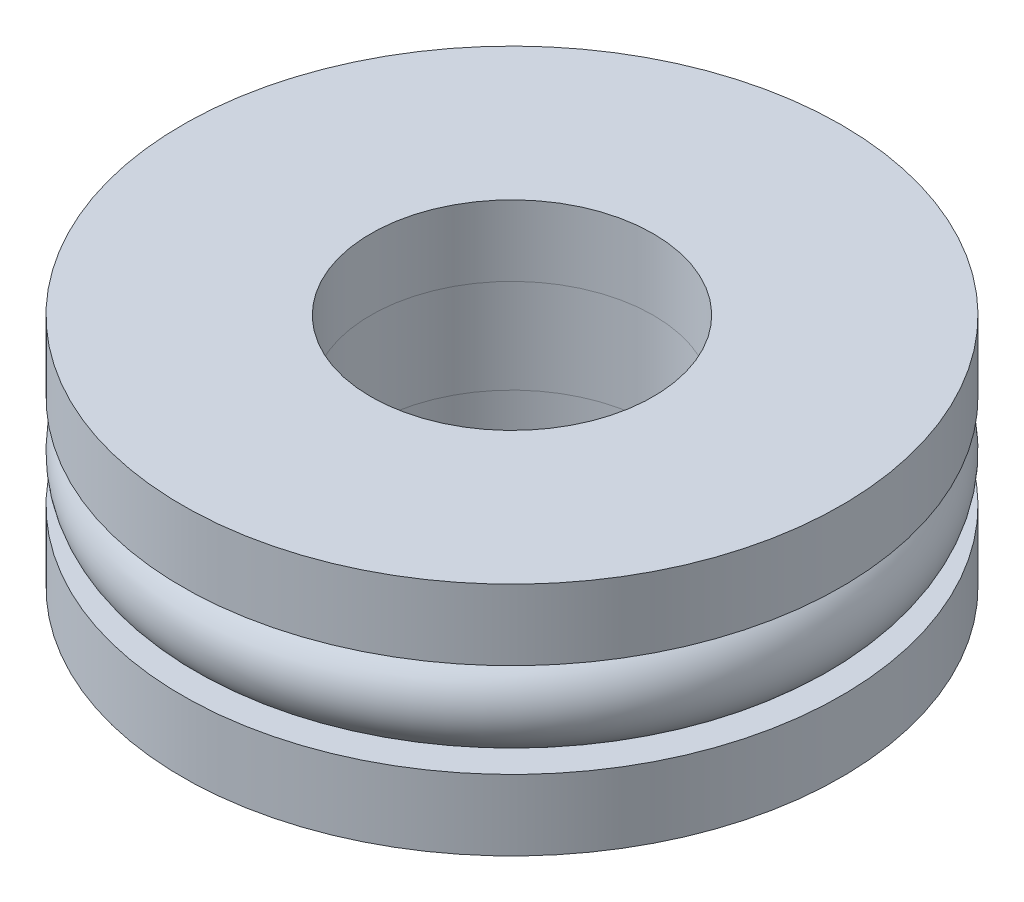
ISO-10303-21;
HEADER;
FILE_DESCRIPTION(('STEP AP214'),'2;1');
FILE_NAME('part.step','',(''),(''),'','','');
FILE_SCHEMA(('AUTOMOTIVE_DESIGN { 1 0 10303 214 1 1 1 1 }'));
ENDSEC;
DATA;
#1=APPLICATION_CONTEXT('core data for automotive mechanical design processes');
#2=APPLICATION_PROTOCOL_DEFINITION('international standard','automotive_design',2000,#1);
#3=PRODUCT_CONTEXT('',#1,'mechanical');
#4=PRODUCT('Part','Part','',(#3));
#5=PRODUCT_RELATED_PRODUCT_CATEGORY('part','',(#4));
#6=PRODUCT_DEFINITION_FORMATION('','',#4);
#7=PRODUCT_DEFINITION_CONTEXT('part definition',#1,'design');
#8=PRODUCT_DEFINITION('design','',#6,#7);
#9=PRODUCT_DEFINITION_SHAPE('','',#8);
#10=(LENGTH_UNIT() NAMED_UNIT(*) SI_UNIT(.MILLI.,.METRE.));
#11=(NAMED_UNIT(*) PLANE_ANGLE_UNIT() SI_UNIT($,.RADIAN.));
#12=(NAMED_UNIT(*) SI_UNIT($,.STERADIAN.) SOLID_ANGLE_UNIT());
#13=UNCERTAINTY_MEASURE_WITH_UNIT(LENGTH_MEASURE(1.E-05),#10,'distance_accuracy_value','');
#14=(GEOMETRIC_REPRESENTATION_CONTEXT(3) GLOBAL_UNCERTAINTY_ASSIGNED_CONTEXT((#13)) GLOBAL_UNIT_ASSIGNED_CONTEXT((#10,
#11,#12)) REPRESENTATION_CONTEXT('',''));
#15=CARTESIAN_POINT('',(0.,0.,0.));
#16=DIRECTION('',(0.,0.,1.));
#17=DIRECTION('',(1.,0.,0.));
#18=AXIS2_PLACEMENT_3D('',#15,#16,#17);
#19=CARTESIAN_POINT('',(0.,3.5,-7.));
#20=DIRECTION('',(0.,-1.,0.));
#21=DIRECTION('',(0.,0.,-1.));
#22=AXIS2_PLACEMENT_3D('',#19,#20,#21);
#23=PLANE('',#22);
#24=CARTESIAN_POINT('',(0.,3.5,0.));
#25=DIRECTION('',(0.,-1.,0.));
#26=DIRECTION('',(0.,0.,-1.));
#27=AXIS2_PLACEMENT_3D('',#24,#25,#26);
#28=CIRCLE('',#27,3.);
#29=CARTESIAN_POINT('',(0.,3.5,-3.));
#30=VERTEX_POINT('',#29);
#31=EDGE_CURVE('E53',#30,#30,#28,.F.);
#32=ORIENTED_EDGE('',*,*,#31,.F.);
#33=EDGE_LOOP('',(#32));
#34=FACE_BOUND('',#33,.T.);
#35=CARTESIAN_POINT('',(0.,3.5,0.));
#36=DIRECTION('',(0.,-1.,0.));
#37=DIRECTION('',(0.,0.,-1.));
#38=AXIS2_PLACEMENT_3D('',#35,#36,#37);
#39=CIRCLE('',#38,6.);
#40=CARTESIAN_POINT('',(0.,3.5,-6.));
#41=VERTEX_POINT('',#40);
#42=EDGE_CURVE('E63',#41,#41,#39,.T.);
#43=ORIENTED_EDGE('',*,*,#42,.F.);
#44=EDGE_LOOP('',(#43));
#45=FACE_BOUND('',#44,.T.);
#46=ADVANCED_FACE('F49',(#34,#45),#23,.F.);
#47=CARTESIAN_POINT('',(0.,1.5,-7.));
#48=DIRECTION('',(0.,1.,0.));
#49=DIRECTION('',(0.,0.,1.));
#50=AXIS2_PLACEMENT_3D('',#47,#48,#49);
#51=PLANE('',#50);
#52=CARTESIAN_POINT('',(0.,1.5,0.));
#53=DIRECTION('',(0.,-1.,0.));
#54=DIRECTION('',(0.,0.,-1.));
#55=AXIS2_PLACEMENT_3D('',#52,#53,#54);
#56=CIRCLE('',#55,6.);
#57=CARTESIAN_POINT('',(0.,1.5,-6.));
#58=VERTEX_POINT('',#57);
#59=EDGE_CURVE('E11',#58,#58,#56,.T.);
#60=ORIENTED_EDGE('',*,*,#59,.T.);
#61=EDGE_LOOP('',(#60));
#62=FACE_BOUND('',#61,.T.);
#63=CARTESIAN_POINT('',(0.,1.5,0.));
#64=DIRECTION('',(0.,1.,0.));
#65=DIRECTION('',(0.,0.,1.));
#66=AXIS2_PLACEMENT_3D('',#63,#64,#65);
#67=CIRCLE('',#66,3.);
#68=CARTESIAN_POINT('',(0.,1.5,3.));
#69=VERTEX_POINT('',#68);
#70=EDGE_CURVE('E61',#69,#69,#67,.F.);
#71=ORIENTED_EDGE('',*,*,#70,.F.);
#72=EDGE_LOOP('',(#71));
#73=FACE_BOUND('',#72,.T.);
#74=ADVANCED_FACE('F51',(#62,#73),#51,.F.);
#75=CARTESIAN_POINT('',(0.,0.,0.));
#76=DIRECTION('',(0.,-1.,0.));
#77=DIRECTION('',(0.,0.,-1.));
#78=AXIS2_PLACEMENT_3D('',#75,#76,#77);
#79=CYLINDRICAL_SURFACE('',#78,3.);
#80=ORIENTED_EDGE('',*,*,#31,.T.);
#81=EDGE_LOOP('',(#80));
#82=FACE_BOUND('',#81,.T.);
#83=ORIENTED_EDGE('',*,*,#70,.T.);
#84=EDGE_LOOP('',(#83));
#85=FACE_BOUND('',#84,.T.);
#86=ADVANCED_FACE('F68',(#82,#85),#79,.F.);
#87=CARTESIAN_POINT('',(0.,2.5,0.));
#88=DIRECTION('',(0.,-1.,0.));
#89=DIRECTION('',(0.,0.,-1.));
#90=AXIS2_PLACEMENT_3D('',#87,#88,#89);
#91=TOROIDAL_SURFACE('',#90,6.,1.);
#92=ORIENTED_EDGE('',*,*,#59,.F.);
#93=EDGE_LOOP('',(#92));
#94=FACE_BOUND('',#93,.T.);
#95=ORIENTED_EDGE('',*,*,#42,.T.);
#96=EDGE_LOOP('',(#95));
#97=FACE_BOUND('',#96,.T.);
#98=ADVANCED_FACE('F75',(#94,#97),#91,.T.);
#99=CLOSED_SHELL('',(#46,#74,#86,#98));
#100=MANIFOLD_SOLID_BREP('B2',#99);
#101=CARTESIAN_POINT('',(0.,3.5,-7.));
#102=DIRECTION('',(0.,-1.,0.));
#103=DIRECTION('',(0.,0.,-1.));
#104=AXIS2_PLACEMENT_3D('',#101,#102,#103);
#105=PLANE('',#104);
#106=CARTESIAN_POINT('',(0.,3.5,0.));
#107=DIRECTION('',(0.,-1.,0.));
#108=DIRECTION('',(0.,0.,-1.));
#109=AXIS2_PLACEMENT_3D('',#106,#107,#108);
#110=CIRCLE('',#109,3.);
#111=CARTESIAN_POINT('',(0.,3.5,-3.));
#112=VERTEX_POINT('',#111);
#113=EDGE_CURVE('E139',#112,#112,#110,.F.);
#114=ORIENTED_EDGE('',*,*,#113,.T.);
#115=EDGE_LOOP('',(#114));
#116=FACE_BOUND('',#115,.T.);
#117=CARTESIAN_POINT('',(0.,3.5,0.));
#118=DIRECTION('',(0.,-1.,0.));
#119=DIRECTION('',(0.,0.,-1.));
#120=AXIS2_PLACEMENT_3D('',#117,#118,#119);
#121=CIRCLE('',#120,7.);
#122=CARTESIAN_POINT('',(0.,3.5,-7.));
#123=VERTEX_POINT('',#122);
#124=EDGE_CURVE('E48',#123,#123,#121,.T.);
#125=ORIENTED_EDGE('',*,*,#124,.T.);
#126=EDGE_LOOP('',(#125));
#127=FACE_BOUND('',#126,.T.);
#128=ADVANCED_FACE('F135',(#116,#127),#105,.T.);
#129=CARTESIAN_POINT('',(0.,5.,0.));
#130=DIRECTION('',(0.,-1.,0.));
#131=DIRECTION('',(0.,0.,-1.));
#132=AXIS2_PLACEMENT_3D('',#129,#130,#131);
#133=PLANE('',#132);
#134=CARTESIAN_POINT('',(0.,5.,0.));
#135=DIRECTION('',(0.,-1.,0.));
#136=DIRECTION('',(0.,0.,-1.));
#137=AXIS2_PLACEMENT_3D('',#134,#135,#136);
#138=CIRCLE('',#137,7.);
#139=CARTESIAN_POINT('',(0.,5.,-7.));
#140=VERTEX_POINT('',#139);
#141=EDGE_CURVE('E143',#140,#140,#138,.T.);
#142=ORIENTED_EDGE('',*,*,#141,.F.);
#143=EDGE_LOOP('',(#142));
#144=FACE_BOUND('',#143,.T.);
#145=CARTESIAN_POINT('',(0.,5.,0.));
#146=DIRECTION('',(0.,-1.,0.));
#147=DIRECTION('',(0.,0.,-1.));
#148=AXIS2_PLACEMENT_3D('',#145,#146,#147);
#149=CIRCLE('',#148,3.);
#150=CARTESIAN_POINT('',(0.,5.,-3.));
#151=VERTEX_POINT('',#150);
#152=EDGE_CURVE('E147',#151,#151,#149,.T.);
#153=ORIENTED_EDGE('',*,*,#152,.T.);
#154=EDGE_LOOP('',(#153));
#155=FACE_BOUND('',#154,.T.);
#156=ADVANCED_FACE('F163',(#144,#155),#133,.F.);
#157=CARTESIAN_POINT('',(0.,0.,0.));
#158=DIRECTION('',(0.,-1.,0.));
#159=DIRECTION('',(0.,0.,-1.));
#160=AXIS2_PLACEMENT_3D('',#157,#158,#159);
#161=CYLINDRICAL_SURFACE('',#160,7.);
#162=ORIENTED_EDGE('',*,*,#141,.T.);
#163=EDGE_LOOP('',(#162));
#164=FACE_BOUND('',#163,.T.);
#165=ORIENTED_EDGE('',*,*,#124,.F.);
#166=EDGE_LOOP('',(#165));
#167=FACE_BOUND('',#166,.T.);
#168=ADVANCED_FACE('F137',(#164,#167),#161,.T.);
#169=CARTESIAN_POINT('',(0.,0.,0.));
#170=DIRECTION('',(0.,-1.,0.));
#171=DIRECTION('',(0.,0.,-1.));
#172=AXIS2_PLACEMENT_3D('',#169,#170,#171);
#173=CYLINDRICAL_SURFACE('',#172,3.);
#174=ORIENTED_EDGE('',*,*,#152,.F.);
#175=EDGE_LOOP('',(#174));
#176=FACE_BOUND('',#175,.T.);
#177=ORIENTED_EDGE('',*,*,#113,.F.);
#178=EDGE_LOOP('',(#177));
#179=FACE_BOUND('',#178,.T.);
#180=ADVANCED_FACE('F157',(#176,#179),#173,.F.);
#181=CLOSED_SHELL('',(#128,#156,#168,#180));
#182=MANIFOLD_SOLID_BREP('B6',#181);
#183=CARTESIAN_POINT('',(0.,1.5,-7.));
#184=DIRECTION('',(0.,1.,0.));
#185=DIRECTION('',(0.,0.,1.));
#186=AXIS2_PLACEMENT_3D('',#183,#184,#185);
#187=PLANE('',#186);
#188=CARTESIAN_POINT('',(0.,1.5,0.));
#189=DIRECTION('',(0.,1.,0.));
#190=DIRECTION('',(0.,0.,1.));
#191=AXIS2_PLACEMENT_3D('',#188,#189,#190);
#192=CIRCLE('',#191,3.);
#193=CARTESIAN_POINT('',(0.,1.5,3.));
#194=VERTEX_POINT('',#193);
#195=EDGE_CURVE('E221',#194,#194,#192,.F.);
#196=ORIENTED_EDGE('',*,*,#195,.T.);
#197=EDGE_LOOP('',(#196));
#198=FACE_BOUND('',#197,.T.);
#199=CARTESIAN_POINT('',(0.,1.5,0.));
#200=DIRECTION('',(0.,-1.,0.));
#201=DIRECTION('',(0.,0.,-1.));
#202=AXIS2_PLACEMENT_3D('',#199,#200,#201);
#203=CIRCLE('',#202,7.);
#204=CARTESIAN_POINT('',(0.,1.5,-7.));
#205=VERTEX_POINT('',#204);
#206=EDGE_CURVE('E229',#205,#205,#203,.T.);
#207=ORIENTED_EDGE('',*,*,#206,.F.);
#208=EDGE_LOOP('',(#207));
#209=FACE_BOUND('',#208,.T.);
#210=ADVANCED_FACE('F217',(#198,#209),#187,.T.);
#211=CARTESIAN_POINT('',(0.,0.,0.));
#212=DIRECTION('',(0.,-1.,0.));
#213=DIRECTION('',(0.,0.,-1.));
#214=AXIS2_PLACEMENT_3D('',#211,#212,#213);
#215=PLANE('',#214);
#216=CARTESIAN_POINT('',(0.,0.,0.));
#217=DIRECTION('',(0.,-1.,0.));
#218=DIRECTION('',(0.,0.,-1.));
#219=AXIS2_PLACEMENT_3D('',#216,#217,#218);
#220=CIRCLE('',#219,7.);
#221=CARTESIAN_POINT('',(0.,0.,-7.));
#222=VERTEX_POINT('',#221);
#223=EDGE_CURVE('E225',#222,#222,#220,.T.);
#224=ORIENTED_EDGE('',*,*,#223,.T.);
#225=EDGE_LOOP('',(#224));
#226=FACE_BOUND('',#225,.T.);
#227=CARTESIAN_POINT('',(0.,0.,0.));
#228=DIRECTION('',(0.,-1.,0.));
#229=DIRECTION('',(0.,0.,-1.));
#230=AXIS2_PLACEMENT_3D('',#227,#228,#229);
#231=CIRCLE('',#230,3.);
#232=CARTESIAN_POINT('',(0.,0.,-3.));
#233=VERTEX_POINT('',#232);
#234=EDGE_CURVE('E134',#233,#233,#231,.T.);
#235=ORIENTED_EDGE('',*,*,#234,.F.);
#236=EDGE_LOOP('',(#235));
#237=FACE_BOUND('',#236,.T.);
#238=ADVANCED_FACE('F242',(#226,#237),#215,.T.);
#239=CARTESIAN_POINT('',(0.,0.,0.));
#240=DIRECTION('',(0.,-1.,0.));
#241=DIRECTION('',(0.,0.,-1.));
#242=AXIS2_PLACEMENT_3D('',#239,#240,#241);
#243=CYLINDRICAL_SURFACE('',#242,3.);
#244=ORIENTED_EDGE('',*,*,#234,.T.);
#245=EDGE_LOOP('',(#244));
#246=FACE_BOUND('',#245,.T.);
#247=ORIENTED_EDGE('',*,*,#195,.F.);
#248=EDGE_LOOP('',(#247));
#249=FACE_BOUND('',#248,.T.);
#250=ADVANCED_FACE('F240',(#246,#249),#243,.F.);
#251=CARTESIAN_POINT('',(0.,0.,0.));
#252=DIRECTION('',(0.,-1.,0.));
#253=DIRECTION('',(0.,0.,-1.));
#254=AXIS2_PLACEMENT_3D('',#251,#252,#253);
#255=CYLINDRICAL_SURFACE('',#254,7.);
#256=ORIENTED_EDGE('',*,*,#206,.T.);
#257=EDGE_LOOP('',(#256));
#258=FACE_BOUND('',#257,.T.);
#259=ORIENTED_EDGE('',*,*,#223,.F.);
#260=EDGE_LOOP('',(#259));
#261=FACE_BOUND('',#260,.T.);
#262=ADVANCED_FACE('F219',(#258,#261),#255,.T.);
#263=CLOSED_SHELL('',(#210,#238,#250,#262));
#264=MANIFOLD_SOLID_BREP('B43',#263);
#265=ADVANCED_BREP_SHAPE_REPRESENTATION('',(#18,#100,#182,#264),#14);
#266=SHAPE_DEFINITION_REPRESENTATION(#9,#265);
ENDSEC;
END-ISO-10303-21;
